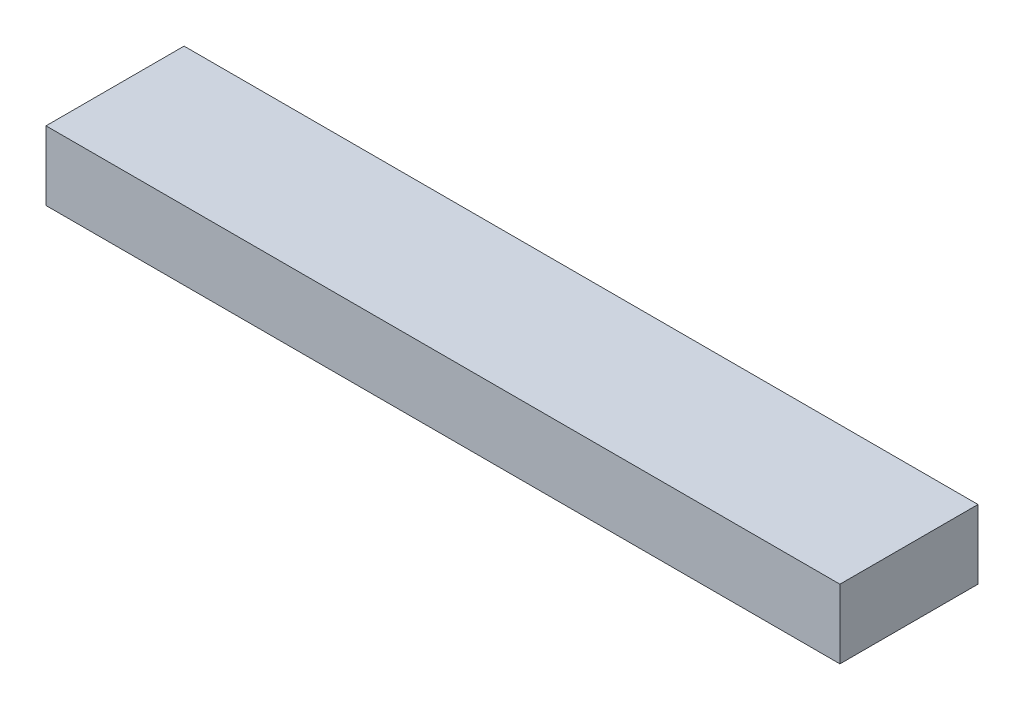
ISO-10303-21;
HEADER;
FILE_DESCRIPTION(('STEP AP214'),'2;1');
FILE_NAME('part.step','',(''),(''),'','','');
FILE_SCHEMA(('AUTOMOTIVE_DESIGN { 1 0 10303 214 1 1 1 1 }'));
ENDSEC;
DATA;
#1=APPLICATION_CONTEXT('core data for automotive mechanical design processes');
#2=APPLICATION_PROTOCOL_DEFINITION('international standard','automotive_design',2000,#1);
#3=PRODUCT_CONTEXT('',#1,'mechanical');
#4=PRODUCT('Part','Part','',(#3));
#5=PRODUCT_RELATED_PRODUCT_CATEGORY('part','',(#4));
#6=PRODUCT_DEFINITION_FORMATION('','',#4);
#7=PRODUCT_DEFINITION_CONTEXT('part definition',#1,'design');
#8=PRODUCT_DEFINITION('design','',#6,#7);
#9=PRODUCT_DEFINITION_SHAPE('','',#8);
#10=(LENGTH_UNIT() NAMED_UNIT(*) SI_UNIT(.MILLI.,.METRE.));
#11=(NAMED_UNIT(*) PLANE_ANGLE_UNIT() SI_UNIT($,.RADIAN.));
#12=(NAMED_UNIT(*) SI_UNIT($,.STERADIAN.) SOLID_ANGLE_UNIT());
#13=UNCERTAINTY_MEASURE_WITH_UNIT(LENGTH_MEASURE(1.E-05),#10,'distance_accuracy_value','');
#14=(GEOMETRIC_REPRESENTATION_CONTEXT(3) GLOBAL_UNCERTAINTY_ASSIGNED_CONTEXT((#13)) GLOBAL_UNIT_ASSIGNED_CONTEXT((#10,
#11,#12)) REPRESENTATION_CONTEXT('',''));
#15=CARTESIAN_POINT('',(0.,0.,0.));
#16=DIRECTION('',(0.,0.,1.));
#17=DIRECTION('',(1.,0.,0.));
#18=AXIS2_PLACEMENT_3D('',#15,#16,#17);
#19=CARTESIAN_POINT('',(11.5,2.,-2.));
#20=DIRECTION('',(-1.,0.,0.));
#21=DIRECTION('',(0.,0.,1.));
#22=AXIS2_PLACEMENT_3D('',#19,#20,#21);
#23=PLANE('',#22);
#24=DIRECTION('',(0.,0.,-1.));
#25=VECTOR('',#24,1.);
#26=CARTESIAN_POINT('',(11.5,0.,-2.));
#27=LINE('',#26,#25);
#28=CARTESIAN_POINT('',(11.5,0.,2.));
#29=VERTEX_POINT('',#28);
#30=CARTESIAN_POINT('',(11.5,0.,-2.));
#31=VERTEX_POINT('',#30);
#32=EDGE_CURVE('E107',#29,#31,#27,.T.);
#33=ORIENTED_EDGE('',*,*,#32,.T.);
#34=DIRECTION('',(0.,-1.,0.));
#35=VECTOR('',#34,1.);
#36=CARTESIAN_POINT('',(11.5,2.,-2.));
#37=LINE('',#36,#35);
#38=CARTESIAN_POINT('',(11.5,2.,-2.));
#39=VERTEX_POINT('',#38);
#40=EDGE_CURVE('E11',#39,#31,#37,.T.);
#41=ORIENTED_EDGE('',*,*,#40,.F.);
#42=DIRECTION('',(0.,0.,-1.));
#43=VECTOR('',#42,1.);
#44=CARTESIAN_POINT('',(11.5,2.,-2.));
#45=LINE('',#44,#43);
#46=CARTESIAN_POINT('',(11.5,2.,2.));
#47=VERTEX_POINT('',#46);
#48=EDGE_CURVE('E91',#47,#39,#45,.T.);
#49=ORIENTED_EDGE('',*,*,#48,.F.);
#50=DIRECTION('',(0.,-1.,0.));
#51=VECTOR('',#50,1.);
#52=CARTESIAN_POINT('',(11.5,2.,2.));
#53=LINE('',#52,#51);
#54=EDGE_CURVE('E103',#47,#29,#53,.T.);
#55=ORIENTED_EDGE('',*,*,#54,.T.);
#56=EDGE_LOOP('',(#33,#41,#49,#55));
#57=FACE_BOUND('',#56,.T.);
#58=ADVANCED_FACE('F39',(#57),#23,.F.);
#59=CARTESIAN_POINT('',(-11.5,2.,-2.));
#60=DIRECTION('',(0.,0.,1.));
#61=DIRECTION('',(1.,0.,0.));
#62=AXIS2_PLACEMENT_3D('',#59,#60,#61);
#63=PLANE('',#62);
#64=DIRECTION('',(-1.,0.,0.));
#65=VECTOR('',#64,1.);
#66=CARTESIAN_POINT('',(-11.5,0.,-2.));
#67=LINE('',#66,#65);
#68=CARTESIAN_POINT('',(-11.5,0.,-2.));
#69=VERTEX_POINT('',#68);
#70=EDGE_CURVE('E96',#31,#69,#67,.T.);
#71=ORIENTED_EDGE('',*,*,#70,.T.);
#72=DIRECTION('',(0.,-1.,0.));
#73=VECTOR('',#72,1.);
#74=CARTESIAN_POINT('',(-11.5,2.,-2.));
#75=LINE('',#74,#73);
#76=CARTESIAN_POINT('',(-11.5,2.,-2.));
#77=VERTEX_POINT('',#76);
#78=EDGE_CURVE('E48',#77,#69,#75,.T.);
#79=ORIENTED_EDGE('',*,*,#78,.F.);
#80=DIRECTION('',(-1.,0.,0.));
#81=VECTOR('',#80,1.);
#82=CARTESIAN_POINT('',(-11.5,2.,-2.));
#83=LINE('',#82,#81);
#84=EDGE_CURVE('E86',#39,#77,#83,.T.);
#85=ORIENTED_EDGE('',*,*,#84,.F.);
#86=ORIENTED_EDGE('',*,*,#40,.T.);
#87=EDGE_LOOP('',(#71,#79,#85,#86));
#88=FACE_BOUND('',#87,.T.);
#89=ADVANCED_FACE('F95',(#88),#63,.F.);
#90=CARTESIAN_POINT('',(-11.5,2.,-2.));
#91=DIRECTION('',(1.,0.,0.));
#92=DIRECTION('',(0.,0.,-1.));
#93=AXIS2_PLACEMENT_3D('',#90,#91,#92);
#94=PLANE('',#93);
#95=DIRECTION('',(0.,0.,1.));
#96=VECTOR('',#95,1.);
#97=CARTESIAN_POINT('',(-11.5,0.,-2.));
#98=LINE('',#97,#96);
#99=CARTESIAN_POINT('',(-11.5,0.,2.));
#100=VERTEX_POINT('',#99);
#101=EDGE_CURVE('E73',#69,#100,#98,.T.);
#102=ORIENTED_EDGE('',*,*,#101,.T.);
#103=DIRECTION('',(0.,-1.,0.));
#104=VECTOR('',#103,1.);
#105=CARTESIAN_POINT('',(-11.5,2.,2.));
#106=LINE('',#105,#104);
#107=CARTESIAN_POINT('',(-11.5,2.,2.));
#108=VERTEX_POINT('',#107);
#109=EDGE_CURVE('E98',#108,#100,#106,.T.);
#110=ORIENTED_EDGE('',*,*,#109,.F.);
#111=DIRECTION('',(0.,0.,1.));
#112=VECTOR('',#111,1.);
#113=CARTESIAN_POINT('',(-11.5,2.,-2.));
#114=LINE('',#113,#112);
#115=EDGE_CURVE('E89',#77,#108,#114,.T.);
#116=ORIENTED_EDGE('',*,*,#115,.F.);
#117=ORIENTED_EDGE('',*,*,#78,.T.);
#118=EDGE_LOOP('',(#102,#110,#116,#117));
#119=FACE_BOUND('',#118,.T.);
#120=ADVANCED_FACE('F99',(#119),#94,.F.);
#121=CARTESIAN_POINT('',(-11.5,2.,2.));
#122=DIRECTION('',(0.,0.,-1.));
#123=DIRECTION('',(-1.,0.,0.));
#124=AXIS2_PLACEMENT_3D('',#121,#122,#123);
#125=PLANE('',#124);
#126=DIRECTION('',(1.,0.,0.));
#127=VECTOR('',#126,1.);
#128=CARTESIAN_POINT('',(-11.5,0.,2.));
#129=LINE('',#128,#127);
#130=EDGE_CURVE('E79',#100,#29,#129,.T.);
#131=ORIENTED_EDGE('',*,*,#130,.T.);
#132=ORIENTED_EDGE('',*,*,#54,.F.);
#133=DIRECTION('',(1.,0.,0.));
#134=VECTOR('',#133,1.);
#135=CARTESIAN_POINT('',(-11.5,2.,2.));
#136=LINE('',#135,#134);
#137=EDGE_CURVE('E56',#108,#47,#136,.T.);
#138=ORIENTED_EDGE('',*,*,#137,.F.);
#139=ORIENTED_EDGE('',*,*,#109,.T.);
#140=EDGE_LOOP('',(#131,#132,#138,#139));
#141=FACE_BOUND('',#140,.T.);
#142=ADVANCED_FACE('F120',(#141),#125,.F.);
#143=CARTESIAN_POINT('',(0.,2.,0.));
#144=DIRECTION('',(0.,1.,0.));
#145=DIRECTION('',(0.,0.,1.));
#146=AXIS2_PLACEMENT_3D('',#143,#144,#145);
#147=PLANE('',#146);
#148=ORIENTED_EDGE('',*,*,#48,.T.);
#149=ORIENTED_EDGE('',*,*,#84,.T.);
#150=ORIENTED_EDGE('',*,*,#115,.T.);
#151=ORIENTED_EDGE('',*,*,#137,.T.);
#152=EDGE_LOOP('',(#148,#149,#150,#151));
#153=FACE_BOUND('',#152,.T.);
#154=ADVANCED_FACE('F87',(#153),#147,.T.);
#155=CARTESIAN_POINT('',(0.,0.,0.));
#156=DIRECTION('',(0.,1.,0.));
#157=DIRECTION('',(0.,0.,1.));
#158=AXIS2_PLACEMENT_3D('',#155,#156,#157);
#159=PLANE('',#158);
#160=ORIENTED_EDGE('',*,*,#32,.F.);
#161=ORIENTED_EDGE('',*,*,#130,.F.);
#162=ORIENTED_EDGE('',*,*,#101,.F.);
#163=ORIENTED_EDGE('',*,*,#70,.F.);
#164=EDGE_LOOP('',(#160,#161,#162,#163));
#165=FACE_BOUND('',#164,.T.);
#166=ADVANCED_FACE('F123',(#165),#159,.F.);
#167=CLOSED_SHELL('',(#58,#89,#120,#142,#154,#166));
#168=MANIFOLD_SOLID_BREP('B2',#167);
#169=ADVANCED_BREP_SHAPE_REPRESENTATION('',(#18,#168),#14);
#170=SHAPE_DEFINITION_REPRESENTATION(#9,#169);
ENDSEC;
END-ISO-10303-21;
